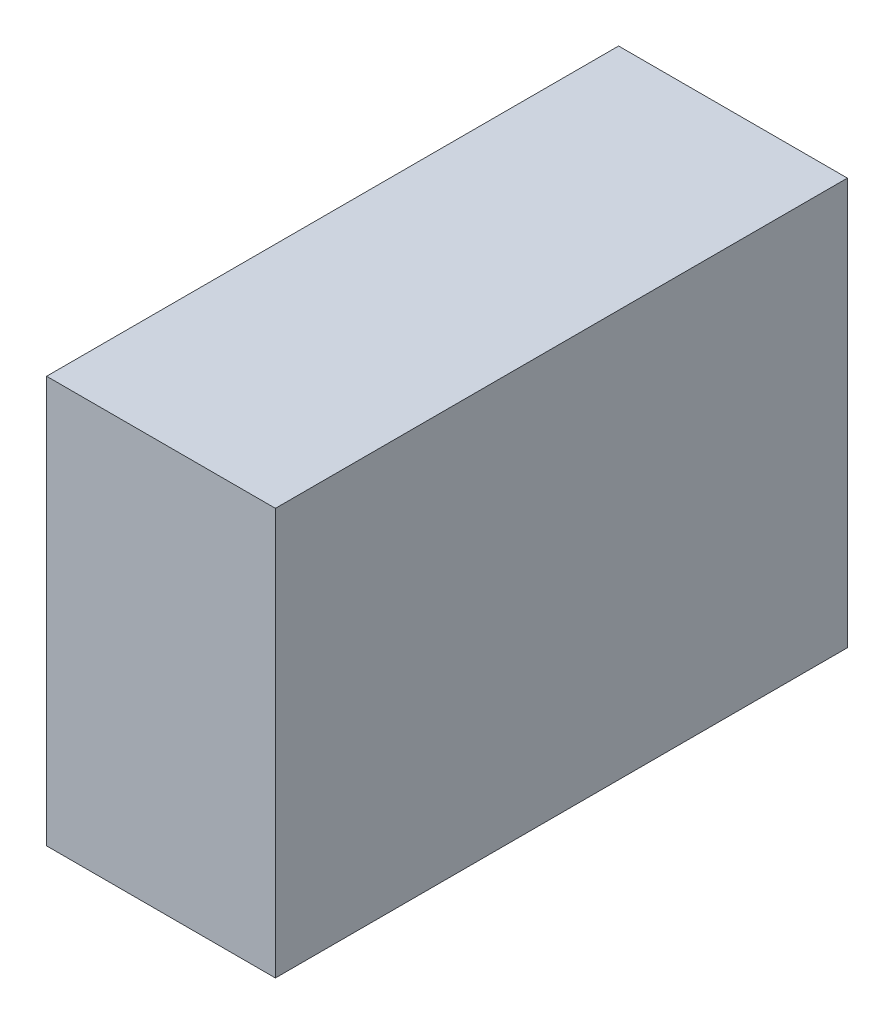
ISO-10303-21;
HEADER;
FILE_DESCRIPTION(('STEP AP214'),'2;1');
FILE_NAME('part.step','',(''),(''),'','','');
FILE_SCHEMA(('AUTOMOTIVE_DESIGN { 1 0 10303 214 1 1 1 1 }'));
ENDSEC;
DATA;
#1=APPLICATION_CONTEXT('core data for automotive mechanical design processes');
#2=APPLICATION_PROTOCOL_DEFINITION('international standard','automotive_design',2000,#1);
#3=PRODUCT_CONTEXT('',#1,'mechanical');
#4=PRODUCT('Part','Part','',(#3));
#5=PRODUCT_RELATED_PRODUCT_CATEGORY('part','',(#4));
#6=PRODUCT_DEFINITION_FORMATION('','',#4);
#7=PRODUCT_DEFINITION_CONTEXT('part definition',#1,'design');
#8=PRODUCT_DEFINITION('design','',#6,#7);
#9=PRODUCT_DEFINITION_SHAPE('','',#8);
#10=(LENGTH_UNIT() NAMED_UNIT(*) SI_UNIT(.MILLI.,.METRE.));
#11=(NAMED_UNIT(*) PLANE_ANGLE_UNIT() SI_UNIT($,.RADIAN.));
#12=(NAMED_UNIT(*) SI_UNIT($,.STERADIAN.) SOLID_ANGLE_UNIT());
#13=UNCERTAINTY_MEASURE_WITH_UNIT(LENGTH_MEASURE(1.E-05),#10,'distance_accuracy_value','');
#14=(GEOMETRIC_REPRESENTATION_CONTEXT(3) GLOBAL_UNCERTAINTY_ASSIGNED_CONTEXT((#13)) GLOBAL_UNIT_ASSIGNED_CONTEXT((#10,
#11,#12)) REPRESENTATION_CONTEXT('',''));
#15=CARTESIAN_POINT('',(0.,0.,0.));
#16=DIRECTION('',(0.,0.,1.));
#17=DIRECTION('',(1.,0.,0.));
#18=AXIS2_PLACEMENT_3D('',#15,#16,#17);
#19=CARTESIAN_POINT('',(14.2875,50.8,-35.71875));
#20=DIRECTION('',(-1.,0.,0.));
#21=DIRECTION('',(0.,0.,1.));
#22=AXIS2_PLACEMENT_3D('',#19,#20,#21);
#23=PLANE('',#22);
#24=DIRECTION('',(0.,0.,-1.));
#25=VECTOR('',#24,1.);
#26=CARTESIAN_POINT('',(14.2875,0.,-35.71875));
#27=LINE('',#26,#25);
#28=CARTESIAN_POINT('',(14.2875,0.,35.71875));
#29=VERTEX_POINT('',#28);
#30=CARTESIAN_POINT('',(14.2875,0.,-35.71875));
#31=VERTEX_POINT('',#30);
#32=EDGE_CURVE('E106',#29,#31,#27,.T.);
#33=ORIENTED_EDGE('',*,*,#32,.T.);
#34=DIRECTION('',(0.,-1.,0.));
#35=VECTOR('',#34,1.);
#36=CARTESIAN_POINT('',(14.2875,50.8,-35.71875));
#37=LINE('',#36,#35);
#38=CARTESIAN_POINT('',(14.2875,50.8,-35.71875));
#39=VERTEX_POINT('',#38);
#40=EDGE_CURVE('E11',#39,#31,#37,.T.);
#41=ORIENTED_EDGE('',*,*,#40,.F.);
#42=DIRECTION('',(0.,0.,-1.));
#43=VECTOR('',#42,1.);
#44=CARTESIAN_POINT('',(14.2875,50.8,-35.71875));
#45=LINE('',#44,#43);
#46=CARTESIAN_POINT('',(14.2875,50.8,35.71875));
#47=VERTEX_POINT('',#46);
#48=EDGE_CURVE('E94',#47,#39,#45,.T.);
#49=ORIENTED_EDGE('',*,*,#48,.F.);
#50=DIRECTION('',(0.,-1.,0.));
#51=VECTOR('',#50,1.);
#52=CARTESIAN_POINT('',(14.2875,50.8,35.71875));
#53=LINE('',#52,#51);
#54=EDGE_CURVE('E102',#47,#29,#53,.T.);
#55=ORIENTED_EDGE('',*,*,#54,.T.);
#56=EDGE_LOOP('',(#33,#41,#49,#55));
#57=FACE_BOUND('',#56,.T.);
#58=ADVANCED_FACE('F43',(#57),#23,.F.);
#59=CARTESIAN_POINT('',(-14.2875,50.8,-35.71875));
#60=DIRECTION('',(0.,0.,1.));
#61=DIRECTION('',(1.,0.,0.));
#62=AXIS2_PLACEMENT_3D('',#59,#60,#61);
#63=PLANE('',#62);
#64=DIRECTION('',(-1.,0.,0.));
#65=VECTOR('',#64,1.);
#66=CARTESIAN_POINT('',(-14.2875,0.,-35.71875));
#67=LINE('',#66,#65);
#68=CARTESIAN_POINT('',(-14.2875,0.,-35.71875));
#69=VERTEX_POINT('',#68);
#70=EDGE_CURVE('E98',#31,#69,#67,.T.);
#71=ORIENTED_EDGE('',*,*,#70,.T.);
#72=DIRECTION('',(0.,-1.,0.));
#73=VECTOR('',#72,1.);
#74=CARTESIAN_POINT('',(-14.2875,50.8,-35.71875));
#75=LINE('',#74,#73);
#76=CARTESIAN_POINT('',(-14.2875,50.8,-35.71875));
#77=VERTEX_POINT('',#76);
#78=EDGE_CURVE('E51',#77,#69,#75,.T.);
#79=ORIENTED_EDGE('',*,*,#78,.F.);
#80=DIRECTION('',(-1.,0.,0.));
#81=VECTOR('',#80,1.);
#82=CARTESIAN_POINT('',(-14.2875,50.8,-35.71875));
#83=LINE('',#82,#81);
#84=EDGE_CURVE('E89',#39,#77,#83,.T.);
#85=ORIENTED_EDGE('',*,*,#84,.F.);
#86=ORIENTED_EDGE('',*,*,#40,.T.);
#87=EDGE_LOOP('',(#71,#79,#85,#86));
#88=FACE_BOUND('',#87,.T.);
#89=ADVANCED_FACE('F97',(#88),#63,.F.);
#90=CARTESIAN_POINT('',(-14.2875,50.8,-35.71875));
#91=DIRECTION('',(1.,0.,0.));
#92=DIRECTION('',(0.,0.,-1.));
#93=AXIS2_PLACEMENT_3D('',#90,#91,#92);
#94=PLANE('',#93);
#95=DIRECTION('',(0.,0.,1.));
#96=VECTOR('',#95,1.);
#97=CARTESIAN_POINT('',(-14.2875,0.,-35.71875));
#98=LINE('',#97,#96);
#99=CARTESIAN_POINT('',(-14.2875,0.,35.71875));
#100=VERTEX_POINT('',#99);
#101=EDGE_CURVE('E76',#69,#100,#98,.T.);
#102=ORIENTED_EDGE('',*,*,#101,.T.);
#103=DIRECTION('',(0.,-1.,0.));
#104=VECTOR('',#103,1.);
#105=CARTESIAN_POINT('',(-14.2875,50.8,35.71875));
#106=LINE('',#105,#104);
#107=CARTESIAN_POINT('',(-14.2875,50.8,35.71875));
#108=VERTEX_POINT('',#107);
#109=EDGE_CURVE('E99',#108,#100,#106,.T.);
#110=ORIENTED_EDGE('',*,*,#109,.F.);
#111=DIRECTION('',(0.,0.,1.));
#112=VECTOR('',#111,1.);
#113=CARTESIAN_POINT('',(-14.2875,50.8,-35.71875));
#114=LINE('',#113,#112);
#115=EDGE_CURVE('E92',#77,#108,#114,.T.);
#116=ORIENTED_EDGE('',*,*,#115,.F.);
#117=ORIENTED_EDGE('',*,*,#78,.T.);
#118=EDGE_LOOP('',(#102,#110,#116,#117));
#119=FACE_BOUND('',#118,.T.);
#120=ADVANCED_FACE('F100',(#119),#94,.F.);
#121=CARTESIAN_POINT('',(-14.2875,50.8,35.71875));
#122=DIRECTION('',(0.,0.,-1.));
#123=DIRECTION('',(-1.,0.,0.));
#124=AXIS2_PLACEMENT_3D('',#121,#122,#123);
#125=PLANE('',#124);
#126=DIRECTION('',(1.,0.,0.));
#127=VECTOR('',#126,1.);
#128=CARTESIAN_POINT('',(-14.2875,0.,35.71875));
#129=LINE('',#128,#127);
#130=EDGE_CURVE('E82',#100,#29,#129,.T.);
#131=ORIENTED_EDGE('',*,*,#130,.T.);
#132=ORIENTED_EDGE('',*,*,#54,.F.);
#133=DIRECTION('',(1.,0.,0.));
#134=VECTOR('',#133,1.);
#135=CARTESIAN_POINT('',(-14.2875,50.8,35.71875));
#136=LINE('',#135,#134);
#137=EDGE_CURVE('E59',#108,#47,#136,.T.);
#138=ORIENTED_EDGE('',*,*,#137,.F.);
#139=ORIENTED_EDGE('',*,*,#109,.T.);
#140=EDGE_LOOP('',(#131,#132,#138,#139));
#141=FACE_BOUND('',#140,.T.);
#142=ADVANCED_FACE('F113',(#141),#125,.F.);
#143=CARTESIAN_POINT('',(0.,50.8,0.));
#144=DIRECTION('',(0.,1.,0.));
#145=DIRECTION('',(0.,0.,1.));
#146=AXIS2_PLACEMENT_3D('',#143,#144,#145);
#147=PLANE('',#146);
#148=ORIENTED_EDGE('',*,*,#48,.T.);
#149=ORIENTED_EDGE('',*,*,#84,.T.);
#150=ORIENTED_EDGE('',*,*,#115,.T.);
#151=ORIENTED_EDGE('',*,*,#137,.T.);
#152=EDGE_LOOP('',(#148,#149,#150,#151));
#153=FACE_BOUND('',#152,.T.);
#154=ADVANCED_FACE('F90',(#153),#147,.T.);
#155=CARTESIAN_POINT('',(0.,0.,0.));
#156=DIRECTION('',(0.,1.,0.));
#157=DIRECTION('',(0.,0.,1.));
#158=AXIS2_PLACEMENT_3D('',#155,#156,#157);
#159=PLANE('',#158);
#160=ORIENTED_EDGE('',*,*,#32,.F.);
#161=ORIENTED_EDGE('',*,*,#130,.F.);
#162=ORIENTED_EDGE('',*,*,#101,.F.);
#163=ORIENTED_EDGE('',*,*,#70,.F.);
#164=EDGE_LOOP('',(#160,#161,#162,#163));
#165=FACE_BOUND('',#164,.T.);
#166=ADVANCED_FACE('F116',(#165),#159,.F.);
#167=CLOSED_SHELL('',(#58,#89,#120,#142,#154,#166));
#168=MANIFOLD_SOLID_BREP('B2',#167);
#169=ADVANCED_BREP_SHAPE_REPRESENTATION('',(#18,#168),#14);
#170=SHAPE_DEFINITION_REPRESENTATION(#9,#169);
ENDSEC;
END-ISO-10303-21;
